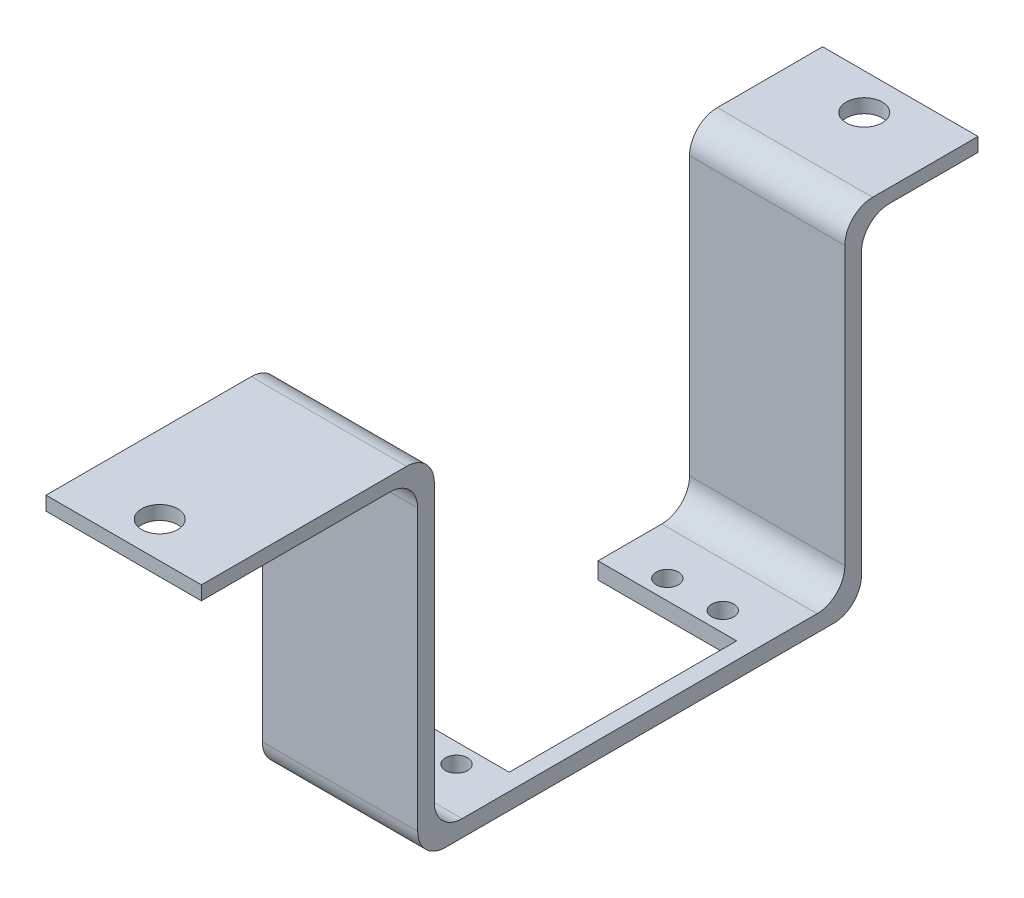
ISO-10303-21;
HEADER;
FILE_DESCRIPTION(('STEP AP214'),'2;1');
FILE_NAME('part.step','',(''),(''),'','','');
FILE_SCHEMA(('AUTOMOTIVE_DESIGN { 1 0 10303 214 1 1 1 1 }'));
ENDSEC;
DATA;
#1=APPLICATION_CONTEXT('core data for automotive mechanical design processes');
#2=APPLICATION_PROTOCOL_DEFINITION('international standard','automotive_design',2000,#1);
#3=PRODUCT_CONTEXT('',#1,'mechanical');
#4=PRODUCT('Part','Part','',(#3));
#5=PRODUCT_RELATED_PRODUCT_CATEGORY('part','',(#4));
#6=PRODUCT_DEFINITION_FORMATION('','',#4);
#7=PRODUCT_DEFINITION_CONTEXT('part definition',#1,'design');
#8=PRODUCT_DEFINITION('design','',#6,#7);
#9=PRODUCT_DEFINITION_SHAPE('','',#8);
#10=(LENGTH_UNIT() NAMED_UNIT(*) SI_UNIT(.MILLI.,.METRE.));
#11=(NAMED_UNIT(*) PLANE_ANGLE_UNIT() SI_UNIT($,.RADIAN.));
#12=(NAMED_UNIT(*) SI_UNIT($,.STERADIAN.) SOLID_ANGLE_UNIT());
#13=UNCERTAINTY_MEASURE_WITH_UNIT(LENGTH_MEASURE(1.E-05),#10,'distance_accuracy_value','');
#14=(GEOMETRIC_REPRESENTATION_CONTEXT(3) GLOBAL_UNCERTAINTY_ASSIGNED_CONTEXT((#13)) GLOBAL_UNIT_ASSIGNED_CONTEXT((#10,
#11,#12)) REPRESENTATION_CONTEXT('',''));
#15=CARTESIAN_POINT('',(0.,0.,0.));
#16=DIRECTION('',(0.,0.,1.));
#17=DIRECTION('',(1.,0.,0.));
#18=AXIS2_PLACEMENT_3D('',#15,#16,#17);
#19=CARTESIAN_POINT('',(-14.,0.,70.));
#20=DIRECTION('',(1.,0.,0.));
#21=DIRECTION('',(0.,0.,-1.));
#22=AXIS2_PLACEMENT_3D('',#19,#20,#21);
#23=PLANE('',#22);
#24=DIRECTION('',(0.,0.,-1.));
#25=VECTOR('',#24,1.);
#26=CARTESIAN_POINT('',(-14.,3.,0.));
#27=LINE('',#26,#25);
#28=CARTESIAN_POINT('',(-14.,3.,23.));
#29=VERTEX_POINT('',#28);
#30=CARTESIAN_POINT('',(-14.,3.,11.5));
#31=VERTEX_POINT('',#30);
#32=EDGE_CURVE('E307',#29,#31,#27,.T.);
#33=ORIENTED_EDGE('',*,*,#32,.T.);
#34=DIRECTION('',(0.,1.,0.));
#35=VECTOR('',#34,1.);
#36=CARTESIAN_POINT('',(-14.,0.,11.5));
#37=LINE('',#36,#35);
#38=CARTESIAN_POINT('',(-14.,0.,11.5));
#39=VERTEX_POINT('',#38);
#40=EDGE_CURVE('E221',#39,#31,#37,.T.);
#41=ORIENTED_EDGE('',*,*,#40,.F.);
#42=DIRECTION('',(0.,0.,-1.));
#43=VECTOR('',#42,1.);
#44=CARTESIAN_POINT('',(-14.,0.,70.));
#45=LINE('',#44,#43);
#46=CARTESIAN_POINT('',(-14.,0.,26.));
#47=VERTEX_POINT('',#46);
#48=EDGE_CURVE('E228',#47,#39,#45,.T.);
#49=ORIENTED_EDGE('',*,*,#48,.F.);
#50=CARTESIAN_POINT('',(-14.,5.,26.));
#51=DIRECTION('',(1.,0.,0.));
#52=DIRECTION('',(0.,0.,-1.));
#53=AXIS2_PLACEMENT_3D('',#50,#51,#52);
#54=CIRCLE('',#53,5.);
#55=CARTESIAN_POINT('',(-14.,5.,31.));
#56=VERTEX_POINT('',#55);
#57=EDGE_CURVE('E455',#47,#56,#54,.F.);
#58=ORIENTED_EDGE('',*,*,#57,.T.);
#59=DIRECTION('',(0.,-1.,0.));
#60=VECTOR('',#59,1.);
#61=CARTESIAN_POINT('',(-14.,3.,31.));
#62=LINE('',#61,#60);
#63=CARTESIAN_POINT('',(-14.,55.5,31.));
#64=VERTEX_POINT('',#63);
#65=EDGE_CURVE('E291',#64,#56,#62,.T.);
#66=ORIENTED_EDGE('',*,*,#65,.F.);
#67=CARTESIAN_POINT('',(-14.,55.5,36.));
#68=DIRECTION('',(1.,0.,0.));
#69=DIRECTION('',(0.,0.,-1.));
#70=AXIS2_PLACEMENT_3D('',#67,#68,#69);
#71=CIRCLE('',#70,5.);
#72=CARTESIAN_POINT('',(-14.,60.5,36.));
#73=VERTEX_POINT('',#72);
#74=EDGE_CURVE('E494',#64,#73,#71,.T.);
#75=ORIENTED_EDGE('',*,*,#74,.T.);
#76=DIRECTION('',(0.,0.,-1.));
#77=VECTOR('',#76,1.);
#78=CARTESIAN_POINT('',(-14.,60.5,0.));
#79=LINE('',#78,#77);
#80=CARTESIAN_POINT('',(-14.,60.5,70.));
#81=VERTEX_POINT('',#80);
#82=EDGE_CURVE('E287',#81,#73,#79,.T.);
#83=ORIENTED_EDGE('',*,*,#82,.F.);
#84=DIRECTION('',(0.,1.,0.));
#85=VECTOR('',#84,1.);
#86=CARTESIAN_POINT('',(-14.,0.,70.));
#87=LINE('',#86,#85);
#88=CARTESIAN_POINT('',(-14.,63.,70.));
#89=VERTEX_POINT('',#88);
#90=EDGE_CURVE('E233',#81,#89,#87,.T.);
#91=ORIENTED_EDGE('',*,*,#90,.T.);
#92=DIRECTION('',(0.,0.,-1.));
#93=VECTOR('',#92,1.);
#94=CARTESIAN_POINT('',(-14.,63.,70.));
#95=LINE('',#94,#93);
#96=CARTESIAN_POINT('',(-14.,63.,33.));
#97=VERTEX_POINT('',#96);
#98=EDGE_CURVE('E229',#89,#97,#95,.T.);
#99=ORIENTED_EDGE('',*,*,#98,.T.);
#100=CARTESIAN_POINT('',(-14.,58.,33.));
#101=DIRECTION('',(1.,0.,0.));
#102=DIRECTION('',(0.,0.,-1.));
#103=AXIS2_PLACEMENT_3D('',#100,#101,#102);
#104=CIRCLE('',#103,5.);
#105=CARTESIAN_POINT('',(-14.,58.,28.));
#106=VERTEX_POINT('',#105);
#107=EDGE_CURVE('E447',#97,#106,#104,.F.);
#108=ORIENTED_EDGE('',*,*,#107,.T.);
#109=DIRECTION('',(0.,-1.,0.));
#110=VECTOR('',#109,1.);
#111=CARTESIAN_POINT('',(-14.,60.5,28.));
#112=LINE('',#111,#110);
#113=CARTESIAN_POINT('',(-14.,8.,28.));
#114=VERTEX_POINT('',#113);
#115=EDGE_CURVE('E302',#106,#114,#112,.T.);
#116=ORIENTED_EDGE('',*,*,#115,.T.);
#117=CARTESIAN_POINT('',(-14.,8.,23.));
#118=DIRECTION('',(1.,0.,0.));
#119=DIRECTION('',(0.,0.,-1.));
#120=AXIS2_PLACEMENT_3D('',#117,#118,#119);
#121=CIRCLE('',#120,5.);
#122=EDGE_CURVE('E488',#114,#29,#121,.T.);
#123=ORIENTED_EDGE('',*,*,#122,.T.);
#124=EDGE_LOOP('',(#33,#41,#49,#58,#66,#75,#83,#91,#99,#108,#116,#123));
#125=FACE_BOUND('',#124,.T.);
#126=ADVANCED_FACE('F42',(#125),#23,.F.);
#127=CARTESIAN_POINT('',(0.,63.,0.));
#128=DIRECTION('',(0.,1.,0.));
#129=DIRECTION('',(0.,0.,1.));
#130=AXIS2_PLACEMENT_3D('',#127,#128,#129);
#131=PLANE('',#130);
#132=DIRECTION('',(0.,0.,1.));
#133=VECTOR('',#132,1.);
#134=CARTESIAN_POINT('',(14.,63.,70.));
#135=LINE('',#134,#133);
#136=CARTESIAN_POINT('',(14.,63.,33.));
#137=VERTEX_POINT('',#136);
#138=CARTESIAN_POINT('',(14.,63.,70.));
#139=VERTEX_POINT('',#138);
#140=EDGE_CURVE('E257',#137,#139,#135,.T.);
#141=ORIENTED_EDGE('',*,*,#140,.F.);
#142=DIRECTION('',(1.,0.,0.));
#143=VECTOR('',#142,1.);
#144=CARTESIAN_POINT('',(0.,63.,33.));
#145=LINE('',#144,#143);
#146=EDGE_CURVE('E476',#137,#97,#145,.F.);
#147=ORIENTED_EDGE('',*,*,#146,.T.);
#148=ORIENTED_EDGE('',*,*,#98,.F.);
#149=DIRECTION('',(1.,0.,0.));
#150=VECTOR('',#149,1.);
#151=CARTESIAN_POINT('',(-16.,63.,70.));
#152=LINE('',#151,#150);
#153=EDGE_CURVE('E373',#89,#139,#152,.T.);
#154=ORIENTED_EDGE('',*,*,#153,.T.);
#155=EDGE_LOOP('',(#141,#147,#148,#154));
#156=FACE_BOUND('',#155,.T.);
#157=CARTESIAN_POINT('',(0.,63.,63.5));
#158=DIRECTION('',(0.,1.,0.));
#159=DIRECTION('',(0.,0.,1.));
#160=AXIS2_PLACEMENT_3D('',#157,#158,#159);
#161=CIRCLE('',#160,3.25);
#162=CARTESIAN_POINT('',(0.,63.,66.75));
#163=VERTEX_POINT('',#162);
#164=EDGE_CURVE('E344',#163,#163,#161,.T.);
#165=ORIENTED_EDGE('',*,*,#164,.F.);
#166=EDGE_LOOP('',(#165));
#167=FACE_BOUND('',#166,.T.);
#168=ADVANCED_FACE('F559',(#156,#167),#131,.T.);
#169=CARTESIAN_POINT('',(0.,3.,0.));
#170=DIRECTION('',(0.,1.,0.));
#171=DIRECTION('',(0.,0.,1.));
#172=AXIS2_PLACEMENT_3D('',#169,#170,#171);
#173=PLANE('',#172);
#174=DIRECTION('',(-1.,0.,0.));
#175=VECTOR('',#174,1.);
#176=CARTESIAN_POINT('',(0.,3.,11.5));
#177=LINE('',#176,#175);
#178=CARTESIAN_POINT('',(11.,3.,11.5));
#179=VERTEX_POINT('',#178);
#180=EDGE_CURVE('E394',#179,#31,#177,.T.);
#181=ORIENTED_EDGE('',*,*,#180,.T.);
#182=ORIENTED_EDGE('',*,*,#32,.F.);
#183=DIRECTION('',(1.,0.,0.));
#184=VECTOR('',#183,1.);
#185=CARTESIAN_POINT('',(14.,3.,23.));
#186=LINE('',#185,#184);
#187=CARTESIAN_POINT('',(14.,3.,23.));
#188=VERTEX_POINT('',#187);
#189=EDGE_CURVE('E400',#29,#188,#186,.T.);
#190=ORIENTED_EDGE('',*,*,#189,.T.);
#191=DIRECTION('',(0.,0.,1.));
#192=VECTOR('',#191,1.);
#193=CARTESIAN_POINT('',(14.,3.,0.));
#194=LINE('',#193,#192);
#195=CARTESIAN_POINT('',(14.,3.,-41.));
#196=VERTEX_POINT('',#195);
#197=EDGE_CURVE('E279',#196,#188,#194,.T.);
#198=ORIENTED_EDGE('',*,*,#197,.F.);
#199=DIRECTION('',(-1.,0.,0.));
#200=VECTOR('',#199,1.);
#201=CARTESIAN_POINT('',(-14.,3.,-41.));
#202=LINE('',#201,#200);
#203=CARTESIAN_POINT('',(-14.,3.,-41.));
#204=VERTEX_POINT('',#203);
#205=EDGE_CURVE('E404',#196,#204,#202,.T.);
#206=ORIENTED_EDGE('',*,*,#205,.T.);
#207=CARTESIAN_POINT('',(-14.,3.,-29.5));
#208=VERTEX_POINT('',#207);
#209=EDGE_CURVE('E306',#208,#204,#27,.T.);
#210=ORIENTED_EDGE('',*,*,#209,.F.);
#211=DIRECTION('',(1.,0.,0.));
#212=VECTOR('',#211,1.);
#213=CARTESIAN_POINT('',(0.,3.,-29.5));
#214=LINE('',#213,#212);
#215=CARTESIAN_POINT('',(11.,3.,-29.5));
#216=VERTEX_POINT('',#215);
#217=EDGE_CURVE('E58',#208,#216,#214,.T.);
#218=ORIENTED_EDGE('',*,*,#217,.T.);
#219=DIRECTION('',(0.,0.,1.));
#220=VECTOR('',#219,1.);
#221=CARTESIAN_POINT('',(11.,3.,0.));
#222=LINE('',#221,#220);
#223=EDGE_CURVE('E390',#216,#179,#222,.T.);
#224=ORIENTED_EDGE('',*,*,#223,.T.);
#225=EDGE_LOOP('',(#181,#182,#190,#198,#206,#210,#218,#224));
#226=FACE_BOUND('',#225,.T.);
#227=CARTESIAN_POINT('',(5.,3.,-33.));
#228=DIRECTION('',(0.,1.,0.));
#229=DIRECTION('',(0.,0.,1.));
#230=AXIS2_PLACEMENT_3D('',#227,#228,#229);
#231=CIRCLE('',#230,2.);
#232=CARTESIAN_POINT('',(5.,3.,-31.));
#233=VERTEX_POINT('',#232);
#234=EDGE_CURVE('E324',#233,#233,#231,.T.);
#235=ORIENTED_EDGE('',*,*,#234,.F.);
#236=EDGE_LOOP('',(#235));
#237=FACE_BOUND('',#236,.T.);
#238=CARTESIAN_POINT('',(-5.,3.,15.));
#239=DIRECTION('',(0.,1.,0.));
#240=DIRECTION('',(0.,0.,1.));
#241=AXIS2_PLACEMENT_3D('',#238,#239,#240);
#242=CIRCLE('',#241,2.);
#243=CARTESIAN_POINT('',(-5.,3.,17.));
#244=VERTEX_POINT('',#243);
#245=EDGE_CURVE('E333',#244,#244,#242,.T.);
#246=ORIENTED_EDGE('',*,*,#245,.F.);
#247=EDGE_LOOP('',(#246));
#248=FACE_BOUND('',#247,.T.);
#249=CARTESIAN_POINT('',(5.,3.,15.));
#250=DIRECTION('',(0.,1.,0.));
#251=DIRECTION('',(0.,0.,1.));
#252=AXIS2_PLACEMENT_3D('',#249,#250,#251);
#253=CIRCLE('',#252,2.);
#254=CARTESIAN_POINT('',(5.,3.,17.));
#255=VERTEX_POINT('',#254);
#256=EDGE_CURVE('E316',#255,#255,#253,.T.);
#257=ORIENTED_EDGE('',*,*,#256,.F.);
#258=EDGE_LOOP('',(#257));
#259=FACE_BOUND('',#258,.T.);
#260=CARTESIAN_POINT('',(-5.,3.,-33.));
#261=DIRECTION('',(0.,1.,0.));
#262=DIRECTION('',(0.,0.,1.));
#263=AXIS2_PLACEMENT_3D('',#260,#261,#262);
#264=CIRCLE('',#263,2.);
#265=CARTESIAN_POINT('',(-5.,3.,-31.));
#266=VERTEX_POINT('',#265);
#267=EDGE_CURVE('E328',#266,#266,#264,.T.);
#268=ORIENTED_EDGE('',*,*,#267,.F.);
#269=EDGE_LOOP('',(#268));
#270=FACE_BOUND('',#269,.T.);
#271=ADVANCED_FACE('F540',(#226,#237,#248,#259,#270),#173,.T.);
#272=CARTESIAN_POINT('',(-13.5,60.5,-46.));
#273=DIRECTION('',(0.,0.,1.));
#274=DIRECTION('',(1.,0.,0.));
#275=AXIS2_PLACEMENT_3D('',#272,#273,#274);
#276=PLANE('',#275);
#277=DIRECTION('',(0.,1.,0.));
#278=VECTOR('',#277,1.);
#279=CARTESIAN_POINT('',(-14.,60.5,-46.));
#280=LINE('',#279,#278);
#281=CARTESIAN_POINT('',(-14.,8.,-46.));
#282=VERTEX_POINT('',#281);
#283=CARTESIAN_POINT('',(-14.,58.,-46.));
#284=VERTEX_POINT('',#283);
#285=EDGE_CURVE('E311',#282,#284,#280,.T.);
#286=ORIENTED_EDGE('',*,*,#285,.F.);
#287=DIRECTION('',(-1.,0.,0.));
#288=VECTOR('',#287,1.);
#289=CARTESIAN_POINT('',(14.,8.,-46.));
#290=LINE('',#289,#288);
#291=CARTESIAN_POINT('',(14.,8.,-46.));
#292=VERTEX_POINT('',#291);
#293=EDGE_CURVE('E412',#282,#292,#290,.F.);
#294=ORIENTED_EDGE('',*,*,#293,.T.);
#295=DIRECTION('',(0.,-1.,0.));
#296=VECTOR('',#295,1.);
#297=CARTESIAN_POINT('',(14.,60.5,-46.));
#298=LINE('',#297,#296);
#299=CARTESIAN_POINT('',(14.,58.,-46.));
#300=VERTEX_POINT('',#299);
#301=EDGE_CURVE('E283',#300,#292,#298,.T.);
#302=ORIENTED_EDGE('',*,*,#301,.F.);
#303=DIRECTION('',(-1.,0.,0.));
#304=VECTOR('',#303,1.);
#305=CARTESIAN_POINT('',(-13.5,58.,-46.));
#306=LINE('',#305,#304);
#307=EDGE_CURVE('E408',#300,#284,#306,.T.);
#308=ORIENTED_EDGE('',*,*,#307,.T.);
#309=EDGE_LOOP('',(#286,#294,#302,#308));
#310=FACE_BOUND('',#309,.T.);
#311=ADVANCED_FACE('F532',(#310),#276,.T.);
#312=CARTESIAN_POINT('',(13.5,60.5,28.));
#313=DIRECTION('',(0.,0.,-1.));
#314=DIRECTION('',(-1.,0.,0.));
#315=AXIS2_PLACEMENT_3D('',#312,#313,#314);
#316=PLANE('',#315);
#317=DIRECTION('',(0.,1.,0.));
#318=VECTOR('',#317,1.);
#319=CARTESIAN_POINT('',(14.,60.5,28.));
#320=LINE('',#319,#318);
#321=CARTESIAN_POINT('',(14.,8.,28.));
#322=VERTEX_POINT('',#321);
#323=CARTESIAN_POINT('',(14.,58.,28.));
#324=VERTEX_POINT('',#323);
#325=EDGE_CURVE('E275',#322,#324,#320,.T.);
#326=ORIENTED_EDGE('',*,*,#325,.F.);
#327=DIRECTION('',(1.,0.,0.));
#328=VECTOR('',#327,1.);
#329=CARTESIAN_POINT('',(-14.,8.,28.));
#330=LINE('',#329,#328);
#331=EDGE_CURVE('E419',#322,#114,#330,.F.);
#332=ORIENTED_EDGE('',*,*,#331,.T.);
#333=ORIENTED_EDGE('',*,*,#115,.F.);
#334=DIRECTION('',(1.,0.,0.));
#335=VECTOR('',#334,1.);
#336=CARTESIAN_POINT('',(13.5,58.,28.));
#337=LINE('',#336,#335);
#338=EDGE_CURVE('E415',#106,#324,#337,.T.);
#339=ORIENTED_EDGE('',*,*,#338,.T.);
#340=EDGE_LOOP('',(#326,#332,#333,#339));
#341=FACE_BOUND('',#340,.T.);
#342=ADVANCED_FACE('F550',(#341),#316,.T.);
#343=CARTESIAN_POINT('',(-11.,53.8,11.5));
#344=DIRECTION('',(0.,0.,-1.));
#345=DIRECTION('',(-1.,0.,0.));
#346=AXIS2_PLACEMENT_3D('',#343,#344,#345);
#347=PLANE('',#346);
#348=DIRECTION('',(0.,-1.,0.));
#349=VECTOR('',#348,1.);
#350=CARTESIAN_POINT('',(11.,53.8,11.5));
#351=LINE('',#350,#349);
#352=CARTESIAN_POINT('',(11.,0.,11.5));
#353=VERTEX_POINT('',#352);
#354=EDGE_CURVE('E369',#179,#353,#351,.T.);
#355=ORIENTED_EDGE('',*,*,#354,.T.);
#356=DIRECTION('',(1.,0.,0.));
#357=VECTOR('',#356,1.);
#358=CARTESIAN_POINT('',(-11.,0.,11.5));
#359=LINE('',#358,#357);
#360=EDGE_CURVE('E66',#39,#353,#359,.T.);
#361=ORIENTED_EDGE('',*,*,#360,.F.);
#362=ORIENTED_EDGE('',*,*,#40,.T.);
#363=ORIENTED_EDGE('',*,*,#180,.F.);
#364=EDGE_LOOP('',(#355,#361,#362,#363));
#365=FACE_BOUND('',#364,.T.);
#366=ADVANCED_FACE('F565',(#365),#347,.T.);
#367=CARTESIAN_POINT('',(11.,53.8,-29.5));
#368=DIRECTION('',(-1.,0.,0.));
#369=DIRECTION('',(0.,0.,1.));
#370=AXIS2_PLACEMENT_3D('',#367,#368,#369);
#371=PLANE('',#370);
#372=DIRECTION('',(0.,-1.,0.));
#373=VECTOR('',#372,1.);
#374=CARTESIAN_POINT('',(11.,53.8,-29.5));
#375=LINE('',#374,#373);
#376=CARTESIAN_POINT('',(11.,0.,-29.5));
#377=VERTEX_POINT('',#376);
#378=EDGE_CURVE('E214',#216,#377,#375,.T.);
#379=ORIENTED_EDGE('',*,*,#378,.T.);
#380=DIRECTION('',(0.,0.,-1.));
#381=VECTOR('',#380,1.);
#382=CARTESIAN_POINT('',(11.,0.,-29.5));
#383=LINE('',#382,#381);
#384=EDGE_CURVE('E212',#353,#377,#383,.T.);
#385=ORIENTED_EDGE('',*,*,#384,.F.);
#386=ORIENTED_EDGE('',*,*,#354,.F.);
#387=ORIENTED_EDGE('',*,*,#223,.F.);
#388=EDGE_LOOP('',(#379,#385,#386,#387));
#389=FACE_BOUND('',#388,.T.);
#390=ADVANCED_FACE('F648',(#389),#371,.T.);
#391=CARTESIAN_POINT('',(-11.,53.8,-29.5));
#392=DIRECTION('',(0.,0.,1.));
#393=DIRECTION('',(1.,0.,0.));
#394=AXIS2_PLACEMENT_3D('',#391,#392,#393);
#395=PLANE('',#394);
#396=ORIENTED_EDGE('',*,*,#217,.F.);
#397=DIRECTION('',(0.,1.,0.));
#398=VECTOR('',#397,1.);
#399=CARTESIAN_POINT('',(-14.,0.,-29.5));
#400=LINE('',#399,#398);
#401=CARTESIAN_POINT('',(-14.,0.,-29.5));
#402=VERTEX_POINT('',#401);
#403=EDGE_CURVE('E216',#402,#208,#400,.T.);
#404=ORIENTED_EDGE('',*,*,#403,.F.);
#405=DIRECTION('',(-1.,0.,0.));
#406=VECTOR('',#405,1.);
#407=CARTESIAN_POINT('',(-11.,0.,-29.5));
#408=LINE('',#407,#406);
#409=EDGE_CURVE('E205',#377,#402,#408,.T.);
#410=ORIENTED_EDGE('',*,*,#409,.F.);
#411=ORIENTED_EDGE('',*,*,#378,.F.);
#412=EDGE_LOOP('',(#396,#404,#410,#411));
#413=FACE_BOUND('',#412,.T.);
#414=ADVANCED_FACE('F217',(#413),#395,.T.);
#415=CARTESIAN_POINT('',(0.,0.,0.));
#416=DIRECTION('',(0.,1.,0.));
#417=DIRECTION('',(0.,0.,1.));
#418=AXIS2_PLACEMENT_3D('',#415,#416,#417);
#419=PLANE('',#418);
#420=CARTESIAN_POINT('',(5.,0.,-33.));
#421=DIRECTION('',(0.,1.,0.));
#422=DIRECTION('',(0.,0.,1.));
#423=AXIS2_PLACEMENT_3D('',#420,#421,#422);
#424=CIRCLE('',#423,2.);
#425=CARTESIAN_POINT('',(5.,0.,-31.));
#426=VERTEX_POINT('',#425);
#427=EDGE_CURVE('E329',#426,#426,#424,.T.);
#428=ORIENTED_EDGE('',*,*,#427,.T.);
#429=EDGE_LOOP('',(#428));
#430=FACE_BOUND('',#429,.T.);
#431=CARTESIAN_POINT('',(-5.,0.,15.));
#432=DIRECTION('',(0.,1.,0.));
#433=DIRECTION('',(0.,0.,1.));
#434=AXIS2_PLACEMENT_3D('',#431,#432,#433);
#435=CIRCLE('',#434,2.);
#436=CARTESIAN_POINT('',(-5.,0.,17.));
#437=VERTEX_POINT('',#436);
#438=EDGE_CURVE('E320',#437,#437,#435,.T.);
#439=ORIENTED_EDGE('',*,*,#438,.T.);
#440=EDGE_LOOP('',(#439));
#441=FACE_BOUND('',#440,.T.);
#442=CARTESIAN_POINT('',(5.,0.,15.));
#443=DIRECTION('',(0.,1.,0.));
#444=DIRECTION('',(0.,0.,1.));
#445=AXIS2_PLACEMENT_3D('',#442,#443,#444);
#446=CIRCLE('',#445,2.);
#447=CARTESIAN_POINT('',(5.,0.,17.));
#448=VERTEX_POINT('',#447);
#449=EDGE_CURVE('E315',#448,#448,#446,.T.);
#450=ORIENTED_EDGE('',*,*,#449,.T.);
#451=EDGE_LOOP('',(#450));
#452=FACE_BOUND('',#451,.T.);
#453=CARTESIAN_POINT('',(-5.,0.,-33.));
#454=DIRECTION('',(0.,1.,0.));
#455=DIRECTION('',(0.,0.,1.));
#456=AXIS2_PLACEMENT_3D('',#453,#454,#455);
#457=CIRCLE('',#456,2.);
#458=CARTESIAN_POINT('',(-5.,0.,-31.));
#459=VERTEX_POINT('',#458);
#460=EDGE_CURVE('E340',#459,#459,#457,.T.);
#461=ORIENTED_EDGE('',*,*,#460,.T.);
#462=EDGE_LOOP('',(#461));
#463=FACE_BOUND('',#462,.T.);
#464=ORIENTED_EDGE('',*,*,#48,.T.);
#465=ORIENTED_EDGE('',*,*,#360,.T.);
#466=ORIENTED_EDGE('',*,*,#384,.T.);
#467=ORIENTED_EDGE('',*,*,#409,.T.);
#468=CARTESIAN_POINT('',(-14.,0.,-44.));
#469=VERTEX_POINT('',#468);
#470=EDGE_CURVE('E209',#402,#469,#45,.T.);
#471=ORIENTED_EDGE('',*,*,#470,.T.);
#472=DIRECTION('',(-1.,0.,0.));
#473=VECTOR('',#472,1.);
#474=CARTESIAN_POINT('',(0.,0.,-44.));
#475=LINE('',#474,#473);
#476=CARTESIAN_POINT('',(14.,0.,-44.));
#477=VERTEX_POINT('',#476);
#478=EDGE_CURVE('E441',#469,#477,#475,.F.);
#479=ORIENTED_EDGE('',*,*,#478,.T.);
#480=DIRECTION('',(0.,0.,1.));
#481=VECTOR('',#480,1.);
#482=CARTESIAN_POINT('',(14.,0.,70.));
#483=LINE('',#482,#481);
#484=CARTESIAN_POINT('',(14.,0.,26.));
#485=VERTEX_POINT('',#484);
#486=EDGE_CURVE('E249',#477,#485,#483,.T.);
#487=ORIENTED_EDGE('',*,*,#486,.T.);
#488=DIRECTION('',(1.,0.,0.));
#489=VECTOR('',#488,1.);
#490=CARTESIAN_POINT('',(0.,0.,26.));
#491=LINE('',#490,#489);
#492=EDGE_CURVE('E444',#485,#47,#491,.F.);
#493=ORIENTED_EDGE('',*,*,#492,.T.);
#494=EDGE_LOOP('',(#464,#465,#466,#467,#471,#479,#487,#493));
#495=FACE_BOUND('',#494,.T.);
#496=ADVANCED_FACE('F207',(#430,#441,#452,#463,#495),#419,.F.);
#497=CARTESIAN_POINT('',(-16.,3.,31.));
#498=DIRECTION('',(0.,0.,-1.));
#499=DIRECTION('',(-1.,0.,0.));
#500=AXIS2_PLACEMENT_3D('',#497,#498,#499);
#501=PLANE('',#500);
#502=ORIENTED_EDGE('',*,*,#65,.T.);
#503=DIRECTION('',(1.,0.,0.));
#504=VECTOR('',#503,1.);
#505=CARTESIAN_POINT('',(-16.,5.,31.));
#506=LINE('',#505,#504);
#507=CARTESIAN_POINT('',(14.,5.,31.));
#508=VERTEX_POINT('',#507);
#509=EDGE_CURVE('E425',#56,#508,#506,.T.);
#510=ORIENTED_EDGE('',*,*,#509,.T.);
#511=DIRECTION('',(0.,1.,0.));
#512=VECTOR('',#511,1.);
#513=CARTESIAN_POINT('',(14.,3.,31.));
#514=LINE('',#513,#512);
#515=CARTESIAN_POINT('',(14.,55.5,31.));
#516=VERTEX_POINT('',#515);
#517=EDGE_CURVE('E263',#508,#516,#514,.T.);
#518=ORIENTED_EDGE('',*,*,#517,.T.);
#519=DIRECTION('',(1.,0.,0.));
#520=VECTOR('',#519,1.);
#521=CARTESIAN_POINT('',(-14.,55.5,31.));
#522=LINE('',#521,#520);
#523=EDGE_CURVE('E422',#516,#64,#522,.F.);
#524=ORIENTED_EDGE('',*,*,#523,.T.);
#525=EDGE_LOOP('',(#502,#510,#518,#524));
#526=FACE_BOUND('',#525,.T.);
#527=ADVANCED_FACE('F583',(#526),#501,.F.);
#528=CARTESIAN_POINT('',(-16.,3.,-49.));
#529=DIRECTION('',(0.,0.,1.));
#530=DIRECTION('',(1.,0.,0.));
#531=AXIS2_PLACEMENT_3D('',#528,#529,#530);
#532=PLANE('',#531);
#533=DIRECTION('',(0.,-1.,0.));
#534=VECTOR('',#533,1.);
#535=CARTESIAN_POINT('',(14.,3.,-49.));
#536=LINE('',#535,#534);
#537=CARTESIAN_POINT('',(14.,55.5,-49.));
#538=VERTEX_POINT('',#537);
#539=CARTESIAN_POINT('',(14.,5.,-49.));
#540=VERTEX_POINT('',#539);
#541=EDGE_CURVE('E271',#538,#540,#536,.T.);
#542=ORIENTED_EDGE('',*,*,#541,.T.);
#543=DIRECTION('',(-1.,0.,0.));
#544=VECTOR('',#543,1.);
#545=CARTESIAN_POINT('',(-16.,5.,-49.));
#546=LINE('',#545,#544);
#547=CARTESIAN_POINT('',(-14.,5.,-49.));
#548=VERTEX_POINT('',#547);
#549=EDGE_CURVE('E461',#540,#548,#546,.T.);
#550=ORIENTED_EDGE('',*,*,#549,.T.);
#551=DIRECTION('',(0.,1.,0.));
#552=VECTOR('',#551,1.);
#553=CARTESIAN_POINT('',(-14.,3.,-49.));
#554=LINE('',#553,#552);
#555=CARTESIAN_POINT('',(-14.,55.5,-49.));
#556=VERTEX_POINT('',#555);
#557=EDGE_CURVE('E298',#548,#556,#554,.T.);
#558=ORIENTED_EDGE('',*,*,#557,.T.);
#559=DIRECTION('',(-1.,0.,0.));
#560=VECTOR('',#559,1.);
#561=CARTESIAN_POINT('',(14.,55.5,-49.));
#562=LINE('',#561,#560);
#563=EDGE_CURVE('E458',#556,#538,#562,.F.);
#564=ORIENTED_EDGE('',*,*,#563,.T.);
#565=EDGE_LOOP('',(#542,#550,#558,#564));
#566=FACE_BOUND('',#565,.T.);
#567=ADVANCED_FACE('F503',(#566),#532,.F.);
#568=CARTESIAN_POINT('',(0.,60.5,0.));
#569=DIRECTION('',(0.,1.,0.));
#570=DIRECTION('',(0.,0.,1.));
#571=AXIS2_PLACEMENT_3D('',#568,#569,#570);
#572=PLANE('',#571);
#573=CARTESIAN_POINT('',(0.,60.5,-63.5));
#574=DIRECTION('',(0.,1.,0.));
#575=DIRECTION('',(0.,0.,1.));
#576=AXIS2_PLACEMENT_3D('',#573,#574,#575);
#577=CIRCLE('',#576,3.25);
#578=CARTESIAN_POINT('',(0.,60.5,-60.25));
#579=VERTEX_POINT('',#578);
#580=EDGE_CURVE('E352',#579,#579,#577,.T.);
#581=ORIENTED_EDGE('',*,*,#580,.T.);
#582=EDGE_LOOP('',(#581));
#583=FACE_BOUND('',#582,.T.);
#584=DIRECTION('',(0.,0.,1.));
#585=VECTOR('',#584,1.);
#586=CARTESIAN_POINT('',(14.,60.5,0.));
#587=LINE('',#586,#585);
#588=CARTESIAN_POINT('',(14.,60.5,-70.));
#589=VERTEX_POINT('',#588);
#590=CARTESIAN_POINT('',(14.,60.5,-54.));
#591=VERTEX_POINT('',#590);
#592=EDGE_CURVE('E267',#589,#591,#587,.T.);
#593=ORIENTED_EDGE('',*,*,#592,.T.);
#594=DIRECTION('',(-1.,0.,0.));
#595=VECTOR('',#594,1.);
#596=CARTESIAN_POINT('',(-14.,60.5,-54.));
#597=LINE('',#596,#595);
#598=CARTESIAN_POINT('',(-14.,60.5,-54.));
#599=VERTEX_POINT('',#598);
#600=EDGE_CURVE('E469',#591,#599,#597,.T.);
#601=ORIENTED_EDGE('',*,*,#600,.T.);
#602=DIRECTION('',(0.,0.,-1.));
#603=VECTOR('',#602,1.);
#604=CARTESIAN_POINT('',(-14.,60.5,0.));
#605=LINE('',#604,#603);
#606=CARTESIAN_POINT('',(-14.,60.5,-70.));
#607=VERTEX_POINT('',#606);
#608=EDGE_CURVE('E295',#599,#607,#605,.T.);
#609=ORIENTED_EDGE('',*,*,#608,.T.);
#610=DIRECTION('',(-1.,0.,0.));
#611=VECTOR('',#610,1.);
#612=CARTESIAN_POINT('',(-16.,60.5,-70.));
#613=LINE('',#612,#611);
#614=EDGE_CURVE('E378',#589,#607,#613,.T.);
#615=ORIENTED_EDGE('',*,*,#614,.F.);
#616=EDGE_LOOP('',(#593,#601,#609,#615));
#617=FACE_BOUND('',#616,.T.);
#618=ADVANCED_FACE('F514',(#583,#617),#572,.F.);
#619=CARTESIAN_POINT('',(0.,60.5,63.5));
#620=DIRECTION('',(0.,1.,0.));
#621=DIRECTION('',(0.,0.,1.));
#622=AXIS2_PLACEMENT_3D('',#619,#620,#621);
#623=CIRCLE('',#622,3.25);
#624=CARTESIAN_POINT('',(0.,60.5,66.75));
#625=VERTEX_POINT('',#624);
#626=EDGE_CURVE('E359',#625,#625,#623,.T.);
#627=ORIENTED_EDGE('',*,*,#626,.T.);
#628=EDGE_LOOP('',(#627));
#629=FACE_BOUND('',#628,.T.);
#630=ORIENTED_EDGE('',*,*,#82,.T.);
#631=DIRECTION('',(1.,0.,0.));
#632=VECTOR('',#631,1.);
#633=CARTESIAN_POINT('',(14.,60.5,36.));
#634=LINE('',#633,#632);
#635=CARTESIAN_POINT('',(14.,60.5,36.));
#636=VERTEX_POINT('',#635);
#637=EDGE_CURVE('E465',#73,#636,#634,.T.);
#638=ORIENTED_EDGE('',*,*,#637,.T.);
#639=DIRECTION('',(0.,0.,1.));
#640=VECTOR('',#639,1.);
#641=CARTESIAN_POINT('',(14.,60.5,0.));
#642=LINE('',#641,#640);
#643=CARTESIAN_POINT('',(14.,60.5,70.));
#644=VERTEX_POINT('',#643);
#645=EDGE_CURVE('E243',#636,#644,#642,.T.);
#646=ORIENTED_EDGE('',*,*,#645,.T.);
#647=DIRECTION('',(1.,0.,0.));
#648=VECTOR('',#647,1.);
#649=CARTESIAN_POINT('',(-16.,60.5,70.));
#650=LINE('',#649,#648);
#651=EDGE_CURVE('E372',#81,#644,#650,.T.);
#652=ORIENTED_EDGE('',*,*,#651,.F.);
#653=EDGE_LOOP('',(#630,#638,#646,#652));
#654=FACE_BOUND('',#653,.T.);
#655=ADVANCED_FACE('F575',(#629,#654),#572,.F.);
#656=CARTESIAN_POINT('',(-16.,63.,70.));
#657=DIRECTION('',(0.,0.,-1.));
#658=DIRECTION('',(-1.,0.,0.));
#659=AXIS2_PLACEMENT_3D('',#656,#657,#658);
#660=PLANE('',#659);
#661=ORIENTED_EDGE('',*,*,#153,.F.);
#662=ORIENTED_EDGE('',*,*,#90,.F.);
#663=ORIENTED_EDGE('',*,*,#651,.T.);
#664=DIRECTION('',(0.,1.,0.));
#665=VECTOR('',#664,1.);
#666=CARTESIAN_POINT('',(14.,0.,70.));
#667=LINE('',#666,#665);
#668=EDGE_CURVE('E250',#644,#139,#667,.T.);
#669=ORIENTED_EDGE('',*,*,#668,.T.);
#670=EDGE_LOOP('',(#661,#662,#663,#669));
#671=FACE_BOUND('',#670,.T.);
#672=ADVANCED_FACE('F571',(#671),#660,.F.);
#673=CARTESIAN_POINT('',(-16.,63.,-70.));
#674=DIRECTION('',(0.,0.,1.));
#675=DIRECTION('',(1.,0.,0.));
#676=AXIS2_PLACEMENT_3D('',#673,#674,#675);
#677=PLANE('',#676);
#678=ORIENTED_EDGE('',*,*,#614,.T.);
#679=DIRECTION('',(0.,1.,0.));
#680=VECTOR('',#679,1.);
#681=CARTESIAN_POINT('',(-14.,0.,-70.));
#682=LINE('',#681,#680);
#683=CARTESIAN_POINT('',(-14.,63.,-70.));
#684=VERTEX_POINT('',#683);
#685=EDGE_CURVE('E239',#607,#684,#682,.T.);
#686=ORIENTED_EDGE('',*,*,#685,.T.);
#687=DIRECTION('',(-1.,0.,0.));
#688=VECTOR('',#687,1.);
#689=CARTESIAN_POINT('',(-16.,63.,-70.));
#690=LINE('',#689,#688);
#691=CARTESIAN_POINT('',(14.,63.,-70.));
#692=VERTEX_POINT('',#691);
#693=EDGE_CURVE('E377',#692,#684,#690,.T.);
#694=ORIENTED_EDGE('',*,*,#693,.F.);
#695=DIRECTION('',(0.,1.,0.));
#696=VECTOR('',#695,1.);
#697=CARTESIAN_POINT('',(14.,0.,-70.));
#698=LINE('',#697,#696);
#699=EDGE_CURVE('E246',#589,#692,#698,.T.);
#700=ORIENTED_EDGE('',*,*,#699,.F.);
#701=EDGE_LOOP('',(#678,#686,#694,#700));
#702=FACE_BOUND('',#701,.T.);
#703=ADVANCED_FACE('F516',(#702),#677,.F.);
#704=DIRECTION('',(0.,0.,-1.));
#705=VECTOR('',#704,1.);
#706=CARTESIAN_POINT('',(-14.,63.,0.));
#707=LINE('',#706,#705);
#708=CARTESIAN_POINT('',(-14.,63.,-51.));
#709=VERTEX_POINT('',#708);
#710=EDGE_CURVE('E397',#709,#684,#707,.T.);
#711=ORIENTED_EDGE('',*,*,#710,.F.);
#712=DIRECTION('',(-1.,0.,0.));
#713=VECTOR('',#712,1.);
#714=CARTESIAN_POINT('',(0.,63.,-51.));
#715=LINE('',#714,#713);
#716=CARTESIAN_POINT('',(14.,63.,-51.));
#717=VERTEX_POINT('',#716);
#718=EDGE_CURVE('E473',#709,#717,#715,.F.);
#719=ORIENTED_EDGE('',*,*,#718,.T.);
#720=EDGE_CURVE('E235',#692,#717,#135,.T.);
#721=ORIENTED_EDGE('',*,*,#720,.F.);
#722=ORIENTED_EDGE('',*,*,#693,.T.);
#723=EDGE_LOOP('',(#711,#719,#721,#722));
#724=FACE_BOUND('',#723,.T.);
#725=CARTESIAN_POINT('',(0.,63.,-63.5));
#726=DIRECTION('',(0.,1.,0.));
#727=DIRECTION('',(0.,0.,1.));
#728=AXIS2_PLACEMENT_3D('',#725,#726,#727);
#729=CIRCLE('',#728,3.25);
#730=CARTESIAN_POINT('',(0.,63.,-60.25));
#731=VERTEX_POINT('',#730);
#732=EDGE_CURVE('E348',#731,#731,#729,.T.);
#733=ORIENTED_EDGE('',*,*,#732,.F.);
#734=EDGE_LOOP('',(#733));
#735=FACE_BOUND('',#734,.T.);
#736=ADVANCED_FACE('F522',(#724,#735),#131,.T.);
#737=CARTESIAN_POINT('',(0.,37.6,-63.5));
#738=DIRECTION('',(0.,1.,0.));
#739=DIRECTION('',(0.,0.,1.));
#740=AXIS2_PLACEMENT_3D('',#737,#738,#739);
#741=CYLINDRICAL_SURFACE('',#740,3.25);
#742=ORIENTED_EDGE('',*,*,#732,.T.);
#743=EDGE_LOOP('',(#742));
#744=FACE_BOUND('',#743,.T.);
#745=ORIENTED_EDGE('',*,*,#580,.F.);
#746=EDGE_LOOP('',(#745));
#747=FACE_BOUND('',#746,.T.);
#748=ADVANCED_FACE('F639',(#744,#747),#741,.F.);
#749=CARTESIAN_POINT('',(0.,37.6,63.5));
#750=DIRECTION('',(0.,1.,0.));
#751=DIRECTION('',(0.,0.,1.));
#752=AXIS2_PLACEMENT_3D('',#749,#750,#751);
#753=CYLINDRICAL_SURFACE('',#752,3.25);
#754=ORIENTED_EDGE('',*,*,#164,.T.);
#755=EDGE_LOOP('',(#754));
#756=FACE_BOUND('',#755,.T.);
#757=ORIENTED_EDGE('',*,*,#626,.F.);
#758=EDGE_LOOP('',(#757));
#759=FACE_BOUND('',#758,.T.);
#760=ADVANCED_FACE('F637',(#756,#759),#753,.F.);
#761=CARTESIAN_POINT('',(-5.,0.,-33.));
#762=DIRECTION('',(0.,1.,0.));
#763=DIRECTION('',(0.,0.,1.));
#764=AXIS2_PLACEMENT_3D('',#761,#762,#763);
#765=CYLINDRICAL_SURFACE('',#764,2.);
#766=ORIENTED_EDGE('',*,*,#460,.F.);
#767=EDGE_LOOP('',(#766));
#768=FACE_BOUND('',#767,.T.);
#769=ORIENTED_EDGE('',*,*,#267,.T.);
#770=EDGE_LOOP('',(#769));
#771=FACE_BOUND('',#770,.T.);
#772=ADVANCED_FACE('F629',(#768,#771),#765,.F.);
#773=CARTESIAN_POINT('',(5.,0.,15.));
#774=DIRECTION('',(0.,1.,0.));
#775=DIRECTION('',(0.,0.,1.));
#776=AXIS2_PLACEMENT_3D('',#773,#774,#775);
#777=CYLINDRICAL_SURFACE('',#776,2.);
#778=ORIENTED_EDGE('',*,*,#449,.F.);
#779=EDGE_LOOP('',(#778));
#780=FACE_BOUND('',#779,.T.);
#781=ORIENTED_EDGE('',*,*,#256,.T.);
#782=EDGE_LOOP('',(#781));
#783=FACE_BOUND('',#782,.T.);
#784=ADVANCED_FACE('F627',(#780,#783),#777,.F.);
#785=CARTESIAN_POINT('',(-5.,0.,15.));
#786=DIRECTION('',(0.,1.,0.));
#787=DIRECTION('',(0.,0.,1.));
#788=AXIS2_PLACEMENT_3D('',#785,#786,#787);
#789=CYLINDRICAL_SURFACE('',#788,2.);
#790=ORIENTED_EDGE('',*,*,#438,.F.);
#791=EDGE_LOOP('',(#790));
#792=FACE_BOUND('',#791,.T.);
#793=ORIENTED_EDGE('',*,*,#245,.T.);
#794=EDGE_LOOP('',(#793));
#795=FACE_BOUND('',#794,.T.);
#796=ADVANCED_FACE('F623',(#792,#795),#789,.F.);
#797=CARTESIAN_POINT('',(5.,0.,-33.));
#798=DIRECTION('',(0.,1.,0.));
#799=DIRECTION('',(0.,0.,1.));
#800=AXIS2_PLACEMENT_3D('',#797,#798,#799);
#801=CYLINDRICAL_SURFACE('',#800,2.);
#802=ORIENTED_EDGE('',*,*,#427,.F.);
#803=EDGE_LOOP('',(#802));
#804=FACE_BOUND('',#803,.T.);
#805=ORIENTED_EDGE('',*,*,#234,.T.);
#806=EDGE_LOOP('',(#805));
#807=FACE_BOUND('',#806,.T.);
#808=ADVANCED_FACE('F617',(#804,#807),#801,.F.);
#809=CARTESIAN_POINT('',(14.,0.,70.));
#810=DIRECTION('',(-1.,0.,0.));
#811=DIRECTION('',(0.,0.,1.));
#812=AXIS2_PLACEMENT_3D('',#809,#810,#811);
#813=PLANE('',#812);
#814=ORIENTED_EDGE('',*,*,#517,.F.);
#815=CARTESIAN_POINT('',(14.,5.,26.));
#816=DIRECTION('',(-1.,0.,0.));
#817=DIRECTION('',(0.,0.,1.));
#818=AXIS2_PLACEMENT_3D('',#815,#816,#817);
#819=CIRCLE('',#818,5.);
#820=EDGE_CURVE('E438',#508,#485,#819,.F.);
#821=ORIENTED_EDGE('',*,*,#820,.T.);
#822=ORIENTED_EDGE('',*,*,#486,.F.);
#823=CARTESIAN_POINT('',(14.,5.,-44.));
#824=DIRECTION('',(-1.,0.,0.));
#825=DIRECTION('',(0.,0.,1.));
#826=AXIS2_PLACEMENT_3D('',#823,#824,#825);
#827=CIRCLE('',#826,5.);
#828=EDGE_CURVE('E435',#477,#540,#827,.F.);
#829=ORIENTED_EDGE('',*,*,#828,.T.);
#830=ORIENTED_EDGE('',*,*,#541,.F.);
#831=CARTESIAN_POINT('',(14.,55.5,-54.));
#832=DIRECTION('',(-1.,0.,0.));
#833=DIRECTION('',(0.,0.,1.));
#834=AXIS2_PLACEMENT_3D('',#831,#832,#833);
#835=CIRCLE('',#834,5.);
#836=EDGE_CURVE('E11',#538,#591,#835,.T.);
#837=ORIENTED_EDGE('',*,*,#836,.T.);
#838=ORIENTED_EDGE('',*,*,#592,.F.);
#839=ORIENTED_EDGE('',*,*,#699,.T.);
#840=ORIENTED_EDGE('',*,*,#720,.T.);
#841=CARTESIAN_POINT('',(14.,58.,-51.));
#842=DIRECTION('',(-1.,0.,0.));
#843=DIRECTION('',(0.,0.,1.));
#844=AXIS2_PLACEMENT_3D('',#841,#842,#843);
#845=CIRCLE('',#844,5.);
#846=EDGE_CURVE('E432',#717,#300,#845,.F.);
#847=ORIENTED_EDGE('',*,*,#846,.T.);
#848=ORIENTED_EDGE('',*,*,#301,.T.);
#849=CARTESIAN_POINT('',(14.,8.,-41.));
#850=DIRECTION('',(-1.,0.,0.));
#851=DIRECTION('',(0.,0.,1.));
#852=AXIS2_PLACEMENT_3D('',#849,#850,#851);
#853=CIRCLE('',#852,5.);
#854=EDGE_CURVE('E482',#292,#196,#853,.T.);
#855=ORIENTED_EDGE('',*,*,#854,.T.);
#856=ORIENTED_EDGE('',*,*,#197,.T.);
#857=CARTESIAN_POINT('',(14.,8.,23.));
#858=DIRECTION('',(-1.,0.,0.));
#859=DIRECTION('',(0.,0.,1.));
#860=AXIS2_PLACEMENT_3D('',#857,#858,#859);
#861=CIRCLE('',#860,5.);
#862=EDGE_CURVE('E485',#188,#322,#861,.T.);
#863=ORIENTED_EDGE('',*,*,#862,.T.);
#864=ORIENTED_EDGE('',*,*,#325,.T.);
#865=CARTESIAN_POINT('',(14.,58.,33.));
#866=DIRECTION('',(-1.,0.,0.));
#867=DIRECTION('',(0.,0.,1.));
#868=AXIS2_PLACEMENT_3D('',#865,#866,#867);
#869=CIRCLE('',#868,5.);
#870=EDGE_CURVE('E429',#324,#137,#869,.F.);
#871=ORIENTED_EDGE('',*,*,#870,.T.);
#872=ORIENTED_EDGE('',*,*,#140,.T.);
#873=ORIENTED_EDGE('',*,*,#668,.F.);
#874=ORIENTED_EDGE('',*,*,#645,.F.);
#875=CARTESIAN_POINT('',(14.,55.5,36.));
#876=DIRECTION('',(-1.,0.,0.));
#877=DIRECTION('',(0.,0.,1.));
#878=AXIS2_PLACEMENT_3D('',#875,#876,#877);
#879=CIRCLE('',#878,5.);
#880=EDGE_CURVE('E491',#636,#516,#879,.T.);
#881=ORIENTED_EDGE('',*,*,#880,.T.);
#882=EDGE_LOOP('',(#814,#821,#822,#829,#830,#837,#838,#839,#840,#847,#848,#855,#856,#863,#864,
#871,#872,#873,#874,#881));
#883=FACE_BOUND('',#882,.T.);
#884=ADVANCED_FACE('F510',(#883),#813,.F.);
#885=ORIENTED_EDGE('',*,*,#470,.F.);
#886=ORIENTED_EDGE('',*,*,#403,.T.);
#887=ORIENTED_EDGE('',*,*,#209,.T.);
#888=CARTESIAN_POINT('',(-14.,8.,-41.));
#889=DIRECTION('',(1.,0.,0.));
#890=DIRECTION('',(0.,0.,-1.));
#891=AXIS2_PLACEMENT_3D('',#888,#889,#890);
#892=CIRCLE('',#891,5.);
#893=EDGE_CURVE('E479',#204,#282,#892,.T.);
#894=ORIENTED_EDGE('',*,*,#893,.T.);
#895=ORIENTED_EDGE('',*,*,#285,.T.);
#896=CARTESIAN_POINT('',(-14.,58.,-51.));
#897=DIRECTION('',(1.,0.,0.));
#898=DIRECTION('',(0.,0.,-1.));
#899=AXIS2_PLACEMENT_3D('',#896,#897,#898);
#900=CIRCLE('',#899,5.);
#901=EDGE_CURVE('E450',#284,#709,#900,.F.);
#902=ORIENTED_EDGE('',*,*,#901,.T.);
#903=ORIENTED_EDGE('',*,*,#710,.T.);
#904=ORIENTED_EDGE('',*,*,#685,.F.);
#905=ORIENTED_EDGE('',*,*,#608,.F.);
#906=CARTESIAN_POINT('',(-14.,55.5,-54.));
#907=DIRECTION('',(1.,0.,0.));
#908=DIRECTION('',(0.,0.,-1.));
#909=AXIS2_PLACEMENT_3D('',#906,#907,#908);
#910=CIRCLE('',#909,5.);
#911=EDGE_CURVE('E51',#599,#556,#910,.T.);
#912=ORIENTED_EDGE('',*,*,#911,.T.);
#913=ORIENTED_EDGE('',*,*,#557,.F.);
#914=CARTESIAN_POINT('',(-14.,5.,-44.));
#915=DIRECTION('',(1.,0.,0.));
#916=DIRECTION('',(0.,0.,-1.));
#917=AXIS2_PLACEMENT_3D('',#914,#915,#916);
#918=CIRCLE('',#917,5.);
#919=EDGE_CURVE('E225',#548,#469,#918,.F.);
#920=ORIENTED_EDGE('',*,*,#919,.T.);
#921=EDGE_LOOP('',(#885,#886,#887,#894,#895,#902,#903,#904,#905,#912,#913,#920));
#922=FACE_BOUND('',#921,.T.);
#923=ADVANCED_FACE('F223',(#922),#23,.F.);
#924=CARTESIAN_POINT('',(0.,8.,-41.));
#925=DIRECTION('',(1.,0.,0.));
#926=DIRECTION('',(0.,0.,-1.));
#927=AXIS2_PLACEMENT_3D('',#924,#925,#926);
#928=CYLINDRICAL_SURFACE('',#927,5.);
#929=ORIENTED_EDGE('',*,*,#854,.F.);
#930=ORIENTED_EDGE('',*,*,#293,.F.);
#931=ORIENTED_EDGE('',*,*,#893,.F.);
#932=ORIENTED_EDGE('',*,*,#205,.F.);
#933=EDGE_LOOP('',(#929,#930,#931,#932));
#934=FACE_BOUND('',#933,.T.);
#935=ADVANCED_FACE('F536',(#934),#928,.F.);
#936=CARTESIAN_POINT('',(0.,8.,23.));
#937=DIRECTION('',(-1.,0.,0.));
#938=DIRECTION('',(0.,0.,1.));
#939=AXIS2_PLACEMENT_3D('',#936,#937,#938);
#940=CYLINDRICAL_SURFACE('',#939,5.);
#941=ORIENTED_EDGE('',*,*,#122,.F.);
#942=ORIENTED_EDGE('',*,*,#331,.F.);
#943=ORIENTED_EDGE('',*,*,#862,.F.);
#944=ORIENTED_EDGE('',*,*,#189,.F.);
#945=EDGE_LOOP('',(#941,#942,#943,#944));
#946=FACE_BOUND('',#945,.T.);
#947=ADVANCED_FACE('F546',(#946),#940,.F.);
#948=CARTESIAN_POINT('',(-16.,5.,26.));
#949=DIRECTION('',(1.,0.,0.));
#950=DIRECTION('',(0.,0.,-1.));
#951=AXIS2_PLACEMENT_3D('',#948,#949,#950);
#952=CYLINDRICAL_SURFACE('',#951,5.);
#953=ORIENTED_EDGE('',*,*,#57,.F.);
#954=ORIENTED_EDGE('',*,*,#492,.F.);
#955=ORIENTED_EDGE('',*,*,#820,.F.);
#956=ORIENTED_EDGE('',*,*,#509,.F.);
#957=EDGE_LOOP('',(#953,#954,#955,#956));
#958=FACE_BOUND('',#957,.T.);
#959=ADVANCED_FACE('F588',(#958),#952,.T.);
#960=CARTESIAN_POINT('',(-16.,5.,-44.));
#961=DIRECTION('',(-1.,0.,0.));
#962=DIRECTION('',(0.,0.,1.));
#963=AXIS2_PLACEMENT_3D('',#960,#961,#962);
#964=CYLINDRICAL_SURFACE('',#963,5.);
#965=ORIENTED_EDGE('',*,*,#828,.F.);
#966=ORIENTED_EDGE('',*,*,#478,.F.);
#967=ORIENTED_EDGE('',*,*,#919,.F.);
#968=ORIENTED_EDGE('',*,*,#549,.F.);
#969=EDGE_LOOP('',(#965,#966,#967,#968));
#970=FACE_BOUND('',#969,.T.);
#971=ADVANCED_FACE('F592',(#970),#964,.T.);
#972=CARTESIAN_POINT('',(0.,55.5,36.));
#973=DIRECTION('',(-1.,0.,0.));
#974=DIRECTION('',(0.,0.,1.));
#975=AXIS2_PLACEMENT_3D('',#972,#973,#974);
#976=CYLINDRICAL_SURFACE('',#975,5.);
#977=ORIENTED_EDGE('',*,*,#74,.F.);
#978=ORIENTED_EDGE('',*,*,#523,.F.);
#979=ORIENTED_EDGE('',*,*,#880,.F.);
#980=ORIENTED_EDGE('',*,*,#637,.F.);
#981=EDGE_LOOP('',(#977,#978,#979,#980));
#982=FACE_BOUND('',#981,.T.);
#983=ADVANCED_FACE('F579',(#982),#976,.F.);
#984=CARTESIAN_POINT('',(0.,55.5,-54.));
#985=DIRECTION('',(1.,0.,0.));
#986=DIRECTION('',(0.,0.,-1.));
#987=AXIS2_PLACEMENT_3D('',#984,#985,#986);
#988=CYLINDRICAL_SURFACE('',#987,5.);
#989=ORIENTED_EDGE('',*,*,#836,.F.);
#990=ORIENTED_EDGE('',*,*,#563,.F.);
#991=ORIENTED_EDGE('',*,*,#911,.F.);
#992=ORIENTED_EDGE('',*,*,#600,.F.);
#993=EDGE_LOOP('',(#989,#990,#991,#992));
#994=FACE_BOUND('',#993,.T.);
#995=ADVANCED_FACE('F507',(#994),#988,.F.);
#996=CARTESIAN_POINT('',(-13.5,58.,-51.));
#997=DIRECTION('',(-1.,0.,0.));
#998=DIRECTION('',(0.,0.,1.));
#999=AXIS2_PLACEMENT_3D('',#996,#997,#998);
#1000=CYLINDRICAL_SURFACE('',#999,5.);
#1001=ORIENTED_EDGE('',*,*,#846,.F.);
#1002=ORIENTED_EDGE('',*,*,#718,.F.);
#1003=ORIENTED_EDGE('',*,*,#901,.F.);
#1004=ORIENTED_EDGE('',*,*,#307,.F.);
#1005=EDGE_LOOP('',(#1001,#1002,#1003,#1004));
#1006=FACE_BOUND('',#1005,.T.);
#1007=ADVANCED_FACE('F526',(#1006),#1000,.T.);
#1008=CARTESIAN_POINT('',(13.5,58.,33.));
#1009=DIRECTION('',(1.,0.,0.));
#1010=DIRECTION('',(0.,0.,-1.));
#1011=AXIS2_PLACEMENT_3D('',#1008,#1009,#1010);
#1012=CYLINDRICAL_SURFACE('',#1011,5.);
#1013=ORIENTED_EDGE('',*,*,#107,.F.);
#1014=ORIENTED_EDGE('',*,*,#146,.F.);
#1015=ORIENTED_EDGE('',*,*,#870,.F.);
#1016=ORIENTED_EDGE('',*,*,#338,.F.);
#1017=EDGE_LOOP('',(#1013,#1014,#1015,#1016));
#1018=FACE_BOUND('',#1017,.T.);
#1019=ADVANCED_FACE('F44',(#1018),#1012,.T.);
#1020=CLOSED_SHELL('',(#126,#168,#271,#311,#342,#366,#390,#414,#496,#527,#567,#618,#655,#672,
#703,#736,#748,#760,#772,#784,#796,#808,#884,#923,#935,#947,#959,#971,#983,#995,#1007,#1019));
#1021=MANIFOLD_SOLID_BREP('B2',#1020);
#1022=ADVANCED_BREP_SHAPE_REPRESENTATION('',(#18,#1021),#14);
#1023=SHAPE_DEFINITION_REPRESENTATION(#9,#1022);
ENDSEC;
END-ISO-10303-21;
